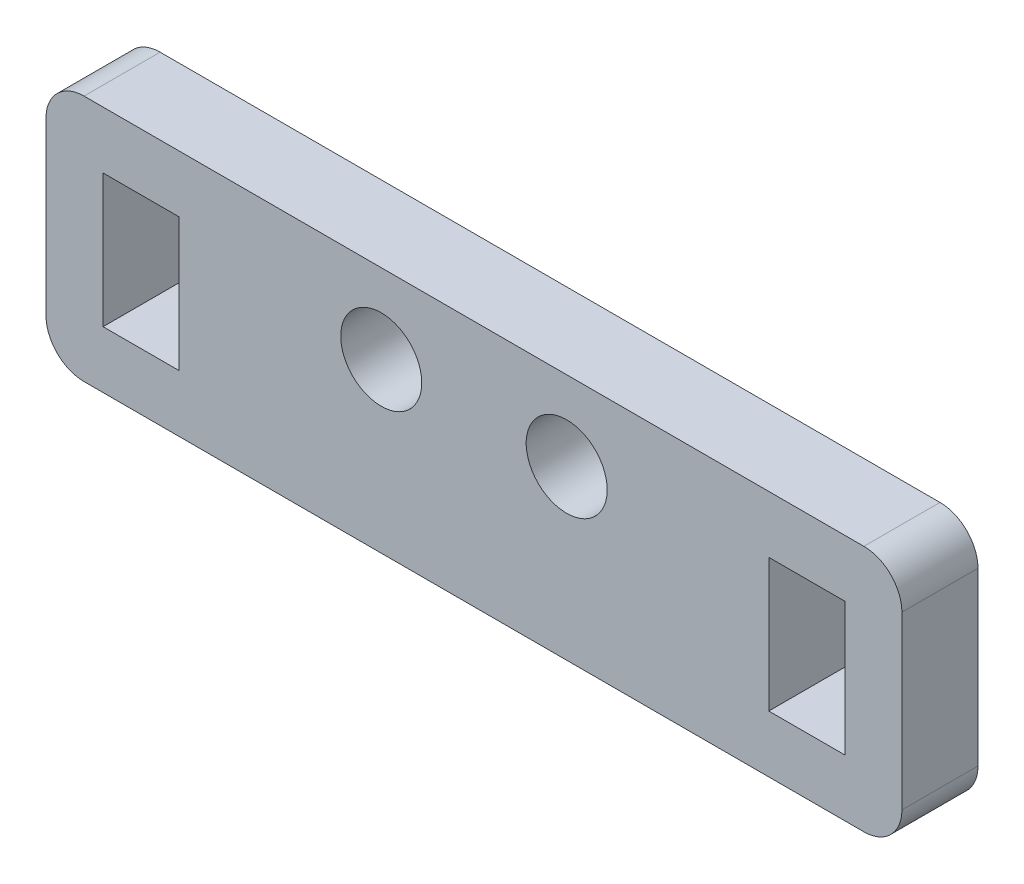
ISO-10303-21;
HEADER;
FILE_DESCRIPTION(('STEP AP214'),'2;1');
FILE_NAME('part.step','',(''),(''),'','','');
FILE_SCHEMA(('AUTOMOTIVE_DESIGN { 1 0 10303 214 1 1 1 1 }'));
ENDSEC;
DATA;
#1=APPLICATION_CONTEXT('core data for automotive mechanical design processes');
#2=APPLICATION_PROTOCOL_DEFINITION('international standard','automotive_design',2000,#1);
#3=PRODUCT_CONTEXT('',#1,'mechanical');
#4=PRODUCT('Part','Part','',(#3));
#5=PRODUCT_RELATED_PRODUCT_CATEGORY('part','',(#4));
#6=PRODUCT_DEFINITION_FORMATION('','',#4);
#7=PRODUCT_DEFINITION_CONTEXT('part definition',#1,'design');
#8=PRODUCT_DEFINITION('design','',#6,#7);
#9=PRODUCT_DEFINITION_SHAPE('','',#8);
#10=(LENGTH_UNIT() NAMED_UNIT(*) SI_UNIT(.MILLI.,.METRE.));
#11=(NAMED_UNIT(*) PLANE_ANGLE_UNIT() SI_UNIT($,.RADIAN.));
#12=(NAMED_UNIT(*) SI_UNIT($,.STERADIAN.) SOLID_ANGLE_UNIT());
#13=UNCERTAINTY_MEASURE_WITH_UNIT(LENGTH_MEASURE(1.E-05),#10,'distance_accuracy_value','');
#14=(GEOMETRIC_REPRESENTATION_CONTEXT(3) GLOBAL_UNCERTAINTY_ASSIGNED_CONTEXT((#13)) GLOBAL_UNIT_ASSIGNED_CONTEXT((#10,
#11,#12)) REPRESENTATION_CONTEXT('',''));
#15=CARTESIAN_POINT('',(0.,0.,0.));
#16=DIRECTION('',(0.,0.,1.));
#17=DIRECTION('',(1.,0.,0.));
#18=AXIS2_PLACEMENT_3D('',#15,#16,#17);
#19=CARTESIAN_POINT('',(0.,0.,4.));
#20=DIRECTION('',(0.,0.,-1.));
#21=DIRECTION('',(-1.,0.,0.));
#22=AXIS2_PLACEMENT_3D('',#19,#20,#21);
#23=PLANE('',#22);
#24=DIRECTION('',(0.,-1.,0.));
#25=VECTOR('',#24,1.);
#26=CARTESIAN_POINT('',(-19.5,3.5,4.));
#27=LINE('',#26,#25);
#28=CARTESIAN_POINT('',(-19.5,3.5,4.));
#29=VERTEX_POINT('',#28);
#30=CARTESIAN_POINT('',(-19.5,-3.5,4.));
#31=VERTEX_POINT('',#30);
#32=EDGE_CURVE('E198',#29,#31,#27,.T.);
#33=ORIENTED_EDGE('',*,*,#32,.F.);
#34=DIRECTION('',(-1.,0.,0.));
#35=VECTOR('',#34,1.);
#36=CARTESIAN_POINT('',(-19.5,3.5,4.));
#37=LINE('',#36,#35);
#38=CARTESIAN_POINT('',(-15.5,3.5,4.));
#39=VERTEX_POINT('',#38);
#40=EDGE_CURVE('E206',#39,#29,#37,.T.);
#41=ORIENTED_EDGE('',*,*,#40,.F.);
#42=DIRECTION('',(0.,1.,0.));
#43=VECTOR('',#42,1.);
#44=CARTESIAN_POINT('',(-15.5,3.5,4.));
#45=LINE('',#44,#43);
#46=CARTESIAN_POINT('',(-15.5,-3.5,4.));
#47=VERTEX_POINT('',#46);
#48=EDGE_CURVE('E203',#47,#39,#45,.T.);
#49=ORIENTED_EDGE('',*,*,#48,.F.);
#50=DIRECTION('',(1.,0.,0.));
#51=VECTOR('',#50,1.);
#52=CARTESIAN_POINT('',(-19.5,-3.5,4.));
#53=LINE('',#52,#51);
#54=EDGE_CURVE('E200',#31,#47,#53,.T.);
#55=ORIENTED_EDGE('',*,*,#54,.F.);
#56=EDGE_LOOP('',(#33,#41,#49,#55));
#57=FACE_BOUND('',#56,.T.);
#58=DIRECTION('',(1.,0.,0.));
#59=VECTOR('',#58,1.);
#60=CARTESIAN_POINT('',(-22.5,-6.5,4.));
#61=LINE('',#60,#59);
#62=CARTESIAN_POINT('',(-20.5,-6.5,4.));
#63=VERTEX_POINT('',#62);
#64=CARTESIAN_POINT('',(20.5,-6.5,4.));
#65=VERTEX_POINT('',#64);
#66=EDGE_CURVE('E232',#63,#65,#61,.T.);
#67=ORIENTED_EDGE('',*,*,#66,.T.);
#68=CARTESIAN_POINT('',(20.5,-4.5,4.));
#69=DIRECTION('',(0.,0.,-1.));
#70=DIRECTION('',(-1.,0.,0.));
#71=AXIS2_PLACEMENT_3D('',#68,#69,#70);
#72=CIRCLE('',#71,2.);
#73=CARTESIAN_POINT('',(22.5,-4.5,4.));
#74=VERTEX_POINT('',#73);
#75=EDGE_CURVE('E272',#65,#74,#72,.F.);
#76=ORIENTED_EDGE('',*,*,#75,.T.);
#77=DIRECTION('',(0.,1.,0.));
#78=VECTOR('',#77,1.);
#79=CARTESIAN_POINT('',(22.5,-6.5,4.));
#80=LINE('',#79,#78);
#81=CARTESIAN_POINT('',(22.5,4.5,4.));
#82=VERTEX_POINT('',#81);
#83=EDGE_CURVE('E236',#74,#82,#80,.T.);
#84=ORIENTED_EDGE('',*,*,#83,.T.);
#85=CARTESIAN_POINT('',(20.5,4.5,4.));
#86=DIRECTION('',(0.,0.,-1.));
#87=DIRECTION('',(-1.,0.,0.));
#88=AXIS2_PLACEMENT_3D('',#85,#86,#87);
#89=CIRCLE('',#88,2.);
#90=CARTESIAN_POINT('',(20.5,6.5,4.));
#91=VERTEX_POINT('',#90);
#92=EDGE_CURVE('E61',#82,#91,#89,.F.);
#93=ORIENTED_EDGE('',*,*,#92,.T.);
#94=DIRECTION('',(-1.,0.,0.));
#95=VECTOR('',#94,1.);
#96=CARTESIAN_POINT('',(-22.5,6.5,4.));
#97=LINE('',#96,#95);
#98=CARTESIAN_POINT('',(-20.5,6.5,4.));
#99=VERTEX_POINT('',#98);
#100=EDGE_CURVE('E238',#91,#99,#97,.T.);
#101=ORIENTED_EDGE('',*,*,#100,.T.);
#102=CARTESIAN_POINT('',(-20.5,4.5,4.));
#103=DIRECTION('',(0.,0.,-1.));
#104=DIRECTION('',(-1.,0.,0.));
#105=AXIS2_PLACEMENT_3D('',#102,#103,#104);
#106=CIRCLE('',#105,2.);
#107=CARTESIAN_POINT('',(-22.5,4.5,4.));
#108=VERTEX_POINT('',#107);
#109=EDGE_CURVE('E267',#99,#108,#106,.F.);
#110=ORIENTED_EDGE('',*,*,#109,.T.);
#111=DIRECTION('',(0.,-1.,0.));
#112=VECTOR('',#111,1.);
#113=CARTESIAN_POINT('',(-22.5,-6.5,4.));
#114=LINE('',#113,#112);
#115=CARTESIAN_POINT('',(-22.5,-4.5,4.));
#116=VERTEX_POINT('',#115);
#117=EDGE_CURVE('E229',#108,#116,#114,.T.);
#118=ORIENTED_EDGE('',*,*,#117,.T.);
#119=CARTESIAN_POINT('',(-20.5,-4.5,4.));
#120=DIRECTION('',(0.,0.,-1.));
#121=DIRECTION('',(-1.,0.,0.));
#122=AXIS2_PLACEMENT_3D('',#119,#120,#121);
#123=CIRCLE('',#122,2.);
#124=EDGE_CURVE('E269',#116,#63,#123,.F.);
#125=ORIENTED_EDGE('',*,*,#124,.T.);
#126=EDGE_LOOP('',(#67,#76,#84,#93,#101,#110,#118,#125));
#127=FACE_BOUND('',#126,.T.);
#128=DIRECTION('',(0.,-1.,0.));
#129=VECTOR('',#128,1.);
#130=CARTESIAN_POINT('',(15.5,3.5,4.));
#131=LINE('',#130,#129);
#132=CARTESIAN_POINT('',(15.5,3.5,4.));
#133=VERTEX_POINT('',#132);
#134=CARTESIAN_POINT('',(15.5,-3.5,4.));
#135=VERTEX_POINT('',#134);
#136=EDGE_CURVE('E154',#133,#135,#131,.T.);
#137=ORIENTED_EDGE('',*,*,#136,.F.);
#138=DIRECTION('',(-1.,0.,0.));
#139=VECTOR('',#138,1.);
#140=CARTESIAN_POINT('',(15.5,3.5,4.));
#141=LINE('',#140,#139);
#142=CARTESIAN_POINT('',(19.5,3.5,4.));
#143=VERTEX_POINT('',#142);
#144=EDGE_CURVE('E180',#143,#133,#141,.T.);
#145=ORIENTED_EDGE('',*,*,#144,.F.);
#146=DIRECTION('',(0.,1.,0.));
#147=VECTOR('',#146,1.);
#148=CARTESIAN_POINT('',(19.5,3.5,4.));
#149=LINE('',#148,#147);
#150=CARTESIAN_POINT('',(19.5,-3.5,4.));
#151=VERTEX_POINT('',#150);
#152=EDGE_CURVE('E178',#151,#143,#149,.T.);
#153=ORIENTED_EDGE('',*,*,#152,.F.);
#154=DIRECTION('',(1.,0.,0.));
#155=VECTOR('',#154,1.);
#156=CARTESIAN_POINT('',(15.5,-3.5,4.));
#157=LINE('',#156,#155);
#158=EDGE_CURVE('E164',#135,#151,#157,.T.);
#159=ORIENTED_EDGE('',*,*,#158,.F.);
#160=EDGE_LOOP('',(#137,#145,#153,#159));
#161=FACE_BOUND('',#160,.T.);
#162=CARTESIAN_POINT('',(4.875,2.32,4.));
#163=DIRECTION('',(0.,0.,1.));
#164=DIRECTION('',(1.,0.,0.));
#165=AXIS2_PLACEMENT_3D('',#162,#163,#164);
#166=CIRCLE('',#165,2.13);
#167=CARTESIAN_POINT('',(7.005,2.32,4.));
#168=VERTEX_POINT('',#167);
#169=EDGE_CURVE('E187',#168,#168,#166,.T.);
#170=ORIENTED_EDGE('',*,*,#169,.F.);
#171=EDGE_LOOP('',(#170));
#172=FACE_BOUND('',#171,.T.);
#173=CARTESIAN_POINT('',(-4.875,2.32,4.));
#174=DIRECTION('',(0.,0.,1.));
#175=DIRECTION('',(1.,0.,0.));
#176=AXIS2_PLACEMENT_3D('',#173,#174,#175);
#177=CIRCLE('',#176,2.13);
#178=CARTESIAN_POINT('',(-2.745,2.32,4.));
#179=VERTEX_POINT('',#178);
#180=EDGE_CURVE('E504',#179,#179,#177,.T.);
#181=ORIENTED_EDGE('',*,*,#180,.F.);
#182=EDGE_LOOP('',(#181));
#183=FACE_BOUND('',#182,.T.);
#184=ADVANCED_FACE('F39',(#57,#127,#161,#172,#183),#23,.F.);
#185=CARTESIAN_POINT('',(0.,0.,0.));
#186=DIRECTION('',(0.,0.,-1.));
#187=DIRECTION('',(-1.,0.,0.));
#188=AXIS2_PLACEMENT_3D('',#185,#186,#187);
#189=PLANE('',#188);
#190=CARTESIAN_POINT('',(4.875,2.32,0.));
#191=DIRECTION('',(0.,0.,1.));
#192=DIRECTION('',(1.,0.,0.));
#193=AXIS2_PLACEMENT_3D('',#190,#191,#192);
#194=CIRCLE('',#193,2.13);
#195=CARTESIAN_POINT('',(7.005,2.32,0.));
#196=VERTEX_POINT('',#195);
#197=EDGE_CURVE('E507',#196,#196,#194,.T.);
#198=ORIENTED_EDGE('',*,*,#197,.T.);
#199=EDGE_LOOP('',(#198));
#200=FACE_BOUND('',#199,.T.);
#201=DIRECTION('',(0.,1.,0.));
#202=VECTOR('',#201,1.);
#203=CARTESIAN_POINT('',(22.5,-6.5,0.));
#204=LINE('',#203,#202);
#205=CARTESIAN_POINT('',(22.5,-4.5,0.));
#206=VERTEX_POINT('',#205);
#207=CARTESIAN_POINT('',(22.5,4.5,0.));
#208=VERTEX_POINT('',#207);
#209=EDGE_CURVE('E246',#206,#208,#204,.T.);
#210=ORIENTED_EDGE('',*,*,#209,.F.);
#211=CARTESIAN_POINT('',(20.5,-4.5,0.));
#212=DIRECTION('',(0.,0.,-1.));
#213=DIRECTION('',(-1.,0.,0.));
#214=AXIS2_PLACEMENT_3D('',#211,#212,#213);
#215=CIRCLE('',#214,2.);
#216=CARTESIAN_POINT('',(20.5,-6.5,0.));
#217=VERTEX_POINT('',#216);
#218=EDGE_CURVE('E260',#206,#217,#215,.T.);
#219=ORIENTED_EDGE('',*,*,#218,.T.);
#220=DIRECTION('',(1.,0.,0.));
#221=VECTOR('',#220,1.);
#222=CARTESIAN_POINT('',(-22.5,-6.5,0.));
#223=LINE('',#222,#221);
#224=CARTESIAN_POINT('',(-20.5,-6.5,0.));
#225=VERTEX_POINT('',#224);
#226=EDGE_CURVE('E243',#225,#217,#223,.T.);
#227=ORIENTED_EDGE('',*,*,#226,.F.);
#228=CARTESIAN_POINT('',(-20.5,-4.5,0.));
#229=DIRECTION('',(0.,0.,-1.));
#230=DIRECTION('',(-1.,0.,0.));
#231=AXIS2_PLACEMENT_3D('',#228,#229,#230);
#232=CIRCLE('',#231,2.);
#233=CARTESIAN_POINT('',(-22.5,-4.5,0.));
#234=VERTEX_POINT('',#233);
#235=EDGE_CURVE('E256',#225,#234,#232,.T.);
#236=ORIENTED_EDGE('',*,*,#235,.T.);
#237=DIRECTION('',(0.,-1.,0.));
#238=VECTOR('',#237,1.);
#239=CARTESIAN_POINT('',(-22.5,-6.5,0.));
#240=LINE('',#239,#238);
#241=CARTESIAN_POINT('',(-22.5,4.5,0.));
#242=VERTEX_POINT('',#241);
#243=EDGE_CURVE('E228',#242,#234,#240,.T.);
#244=ORIENTED_EDGE('',*,*,#243,.F.);
#245=CARTESIAN_POINT('',(-20.5,4.5,0.));
#246=DIRECTION('',(0.,0.,-1.));
#247=DIRECTION('',(-1.,0.,0.));
#248=AXIS2_PLACEMENT_3D('',#245,#246,#247);
#249=CIRCLE('',#248,2.);
#250=CARTESIAN_POINT('',(-20.5,6.5,0.));
#251=VERTEX_POINT('',#250);
#252=EDGE_CURVE('E254',#242,#251,#249,.T.);
#253=ORIENTED_EDGE('',*,*,#252,.T.);
#254=DIRECTION('',(-1.,0.,0.));
#255=VECTOR('',#254,1.);
#256=CARTESIAN_POINT('',(-22.5,6.5,0.));
#257=LINE('',#256,#255);
#258=CARTESIAN_POINT('',(20.5,6.5,0.));
#259=VERTEX_POINT('',#258);
#260=EDGE_CURVE('E233',#259,#251,#257,.T.);
#261=ORIENTED_EDGE('',*,*,#260,.F.);
#262=CARTESIAN_POINT('',(20.5,4.5,0.));
#263=DIRECTION('',(0.,0.,-1.));
#264=DIRECTION('',(-1.,0.,0.));
#265=AXIS2_PLACEMENT_3D('',#262,#263,#264);
#266=CIRCLE('',#265,2.);
#267=EDGE_CURVE('E258',#259,#208,#266,.T.);
#268=ORIENTED_EDGE('',*,*,#267,.T.);
#269=EDGE_LOOP('',(#210,#219,#227,#236,#244,#253,#261,#268));
#270=FACE_BOUND('',#269,.T.);
#271=DIRECTION('',(-1.,0.,0.));
#272=VECTOR('',#271,1.);
#273=CARTESIAN_POINT('',(-19.5,3.5,0.));
#274=LINE('',#273,#272);
#275=CARTESIAN_POINT('',(-15.5,3.5,0.));
#276=VERTEX_POINT('',#275);
#277=CARTESIAN_POINT('',(-19.5,3.5,0.));
#278=VERTEX_POINT('',#277);
#279=EDGE_CURVE('E201',#276,#278,#274,.T.);
#280=ORIENTED_EDGE('',*,*,#279,.T.);
#281=DIRECTION('',(0.,-1.,0.));
#282=VECTOR('',#281,1.);
#283=CARTESIAN_POINT('',(-19.5,3.5,0.));
#284=LINE('',#283,#282);
#285=CARTESIAN_POINT('',(-19.5,-3.5,0.));
#286=VERTEX_POINT('',#285);
#287=EDGE_CURVE('E172',#278,#286,#284,.T.);
#288=ORIENTED_EDGE('',*,*,#287,.T.);
#289=DIRECTION('',(1.,0.,0.));
#290=VECTOR('',#289,1.);
#291=CARTESIAN_POINT('',(-19.5,-3.5,0.));
#292=LINE('',#291,#290);
#293=CARTESIAN_POINT('',(-15.5,-3.5,0.));
#294=VERTEX_POINT('',#293);
#295=EDGE_CURVE('E211',#286,#294,#292,.T.);
#296=ORIENTED_EDGE('',*,*,#295,.T.);
#297=DIRECTION('',(0.,1.,0.));
#298=VECTOR('',#297,1.);
#299=CARTESIAN_POINT('',(-15.5,3.5,0.));
#300=LINE('',#299,#298);
#301=EDGE_CURVE('E214',#294,#276,#300,.T.);
#302=ORIENTED_EDGE('',*,*,#301,.T.);
#303=EDGE_LOOP('',(#280,#288,#296,#302));
#304=FACE_BOUND('',#303,.T.);
#305=DIRECTION('',(-1.,0.,0.));
#306=VECTOR('',#305,1.);
#307=CARTESIAN_POINT('',(15.5,3.5,0.));
#308=LINE('',#307,#306);
#309=CARTESIAN_POINT('',(19.5,3.5,0.));
#310=VERTEX_POINT('',#309);
#311=CARTESIAN_POINT('',(15.5,3.5,0.));
#312=VERTEX_POINT('',#311);
#313=EDGE_CURVE('E165',#310,#312,#308,.T.);
#314=ORIENTED_EDGE('',*,*,#313,.T.);
#315=DIRECTION('',(0.,-1.,0.));
#316=VECTOR('',#315,1.);
#317=CARTESIAN_POINT('',(15.5,3.5,0.));
#318=LINE('',#317,#316);
#319=CARTESIAN_POINT('',(15.5,-3.5,0.));
#320=VERTEX_POINT('',#319);
#321=EDGE_CURVE('E185',#312,#320,#318,.T.);
#322=ORIENTED_EDGE('',*,*,#321,.T.);
#323=DIRECTION('',(1.,0.,0.));
#324=VECTOR('',#323,1.);
#325=CARTESIAN_POINT('',(15.5,-3.5,0.));
#326=LINE('',#325,#324);
#327=CARTESIAN_POINT('',(19.5,-3.5,0.));
#328=VERTEX_POINT('',#327);
#329=EDGE_CURVE('E171',#320,#328,#326,.T.);
#330=ORIENTED_EDGE('',*,*,#329,.T.);
#331=DIRECTION('',(0.,1.,0.));
#332=VECTOR('',#331,1.);
#333=CARTESIAN_POINT('',(19.5,3.5,0.));
#334=LINE('',#333,#332);
#335=EDGE_CURVE('E189',#328,#310,#334,.T.);
#336=ORIENTED_EDGE('',*,*,#335,.T.);
#337=EDGE_LOOP('',(#314,#322,#330,#336));
#338=FACE_BOUND('',#337,.T.);
#339=CARTESIAN_POINT('',(-4.875,2.32,0.));
#340=DIRECTION('',(0.,0.,1.));
#341=DIRECTION('',(1.,0.,0.));
#342=AXIS2_PLACEMENT_3D('',#339,#340,#341);
#343=CIRCLE('',#342,2.13);
#344=CARTESIAN_POINT('',(-2.745,2.32,0.));
#345=VERTEX_POINT('',#344);
#346=EDGE_CURVE('E502',#345,#345,#343,.T.);
#347=ORIENTED_EDGE('',*,*,#346,.T.);
#348=EDGE_LOOP('',(#347));
#349=FACE_BOUND('',#348,.T.);
#350=ADVANCED_FACE('F288',(#200,#270,#304,#338,#349),#189,.T.);
#351=CARTESIAN_POINT('',(-22.5,-6.5,4.));
#352=DIRECTION('',(1.,0.,0.));
#353=DIRECTION('',(0.,0.,-1.));
#354=AXIS2_PLACEMENT_3D('',#351,#352,#353);
#355=PLANE('',#354);
#356=ORIENTED_EDGE('',*,*,#243,.T.);
#357=DIRECTION('',(0.,0.,-1.));
#358=VECTOR('',#357,1.);
#359=CARTESIAN_POINT('',(-22.5,-4.5,4.));
#360=LINE('',#359,#358);
#361=EDGE_CURVE('E11',#234,#116,#360,.F.);
#362=ORIENTED_EDGE('',*,*,#361,.T.);
#363=ORIENTED_EDGE('',*,*,#117,.F.);
#364=DIRECTION('',(0.,0.,-1.));
#365=VECTOR('',#364,1.);
#366=CARTESIAN_POINT('',(-22.5,4.5,4.));
#367=LINE('',#366,#365);
#368=EDGE_CURVE('E47',#108,#242,#367,.T.);
#369=ORIENTED_EDGE('',*,*,#368,.T.);
#370=EDGE_LOOP('',(#356,#362,#363,#369));
#371=FACE_BOUND('',#370,.T.);
#372=ADVANCED_FACE('F282',(#371),#355,.F.);
#373=CARTESIAN_POINT('',(-22.5,-6.5,4.));
#374=DIRECTION('',(0.,1.,0.));
#375=DIRECTION('',(-1.,0.,0.));
#376=AXIS2_PLACEMENT_3D('',#373,#374,#375);
#377=PLANE('',#376);
#378=ORIENTED_EDGE('',*,*,#226,.T.);
#379=DIRECTION('',(0.,0.,-1.));
#380=VECTOR('',#379,1.);
#381=CARTESIAN_POINT('',(20.5,-6.5,4.));
#382=LINE('',#381,#380);
#383=EDGE_CURVE('E265',#217,#65,#382,.F.);
#384=ORIENTED_EDGE('',*,*,#383,.T.);
#385=ORIENTED_EDGE('',*,*,#66,.F.);
#386=DIRECTION('',(0.,0.,-1.));
#387=VECTOR('',#386,1.);
#388=CARTESIAN_POINT('',(-20.5,-6.5,4.));
#389=LINE('',#388,#387);
#390=EDGE_CURVE('E262',#63,#225,#389,.T.);
#391=ORIENTED_EDGE('',*,*,#390,.T.);
#392=EDGE_LOOP('',(#378,#384,#385,#391));
#393=FACE_BOUND('',#392,.T.);
#394=ADVANCED_FACE('F298',(#393),#377,.F.);
#395=CARTESIAN_POINT('',(22.5,-6.5,4.));
#396=DIRECTION('',(-1.,0.,0.));
#397=DIRECTION('',(0.,0.,1.));
#398=AXIS2_PLACEMENT_3D('',#395,#396,#397);
#399=PLANE('',#398);
#400=ORIENTED_EDGE('',*,*,#83,.F.);
#401=DIRECTION('',(0.,0.,-1.));
#402=VECTOR('',#401,1.);
#403=CARTESIAN_POINT('',(22.5,-4.5,4.));
#404=LINE('',#403,#402);
#405=EDGE_CURVE('E251',#74,#206,#404,.T.);
#406=ORIENTED_EDGE('',*,*,#405,.T.);
#407=ORIENTED_EDGE('',*,*,#209,.T.);
#408=DIRECTION('',(0.,0.,-1.));
#409=VECTOR('',#408,1.);
#410=CARTESIAN_POINT('',(22.5,4.5,4.));
#411=LINE('',#410,#409);
#412=EDGE_CURVE('E240',#208,#82,#411,.F.);
#413=ORIENTED_EDGE('',*,*,#412,.T.);
#414=EDGE_LOOP('',(#400,#406,#407,#413));
#415=FACE_BOUND('',#414,.T.);
#416=ADVANCED_FACE('F306',(#415),#399,.F.);
#417=CARTESIAN_POINT('',(-22.5,6.5,4.));
#418=DIRECTION('',(0.,-1.,0.));
#419=DIRECTION('',(1.,0.,0.));
#420=AXIS2_PLACEMENT_3D('',#417,#418,#419);
#421=PLANE('',#420);
#422=ORIENTED_EDGE('',*,*,#100,.F.);
#423=DIRECTION('',(0.,0.,-1.));
#424=VECTOR('',#423,1.);
#425=CARTESIAN_POINT('',(20.5,6.5,4.));
#426=LINE('',#425,#424);
#427=EDGE_CURVE('E275',#91,#259,#426,.T.);
#428=ORIENTED_EDGE('',*,*,#427,.T.);
#429=ORIENTED_EDGE('',*,*,#260,.T.);
#430=DIRECTION('',(0.,0.,-1.));
#431=VECTOR('',#430,1.);
#432=CARTESIAN_POINT('',(-20.5,6.5,4.));
#433=LINE('',#432,#431);
#434=EDGE_CURVE('E54',#251,#99,#433,.F.);
#435=ORIENTED_EDGE('',*,*,#434,.T.);
#436=EDGE_LOOP('',(#422,#428,#429,#435));
#437=FACE_BOUND('',#436,.T.);
#438=ADVANCED_FACE('F311',(#437),#421,.F.);
#439=CARTESIAN_POINT('',(-19.5,3.5,4.));
#440=DIRECTION('',(1.,0.,0.));
#441=DIRECTION('',(0.,0.,-1.));
#442=AXIS2_PLACEMENT_3D('',#439,#440,#441);
#443=PLANE('',#442);
#444=ORIENTED_EDGE('',*,*,#287,.F.);
#445=DIRECTION('',(0.,0.,-1.));
#446=VECTOR('',#445,1.);
#447=CARTESIAN_POINT('',(-19.5,3.5,4.));
#448=LINE('',#447,#446);
#449=EDGE_CURVE('E208',#29,#278,#448,.T.);
#450=ORIENTED_EDGE('',*,*,#449,.F.);
#451=ORIENTED_EDGE('',*,*,#32,.T.);
#452=DIRECTION('',(0.,0.,-1.));
#453=VECTOR('',#452,1.);
#454=CARTESIAN_POINT('',(-19.5,-3.5,4.));
#455=LINE('',#454,#453);
#456=EDGE_CURVE('E225',#31,#286,#455,.T.);
#457=ORIENTED_EDGE('',*,*,#456,.T.);
#458=EDGE_LOOP('',(#444,#450,#451,#457));
#459=FACE_BOUND('',#458,.T.);
#460=ADVANCED_FACE('F327',(#459),#443,.T.);
#461=CARTESIAN_POINT('',(-19.5,-3.5,4.));
#462=DIRECTION('',(0.,1.,0.));
#463=DIRECTION('',(0.,0.,1.));
#464=AXIS2_PLACEMENT_3D('',#461,#462,#463);
#465=PLANE('',#464);
#466=ORIENTED_EDGE('',*,*,#295,.F.);
#467=ORIENTED_EDGE('',*,*,#456,.F.);
#468=ORIENTED_EDGE('',*,*,#54,.T.);
#469=DIRECTION('',(0.,0.,-1.));
#470=VECTOR('',#469,1.);
#471=CARTESIAN_POINT('',(-15.5,-3.5,4.));
#472=LINE('',#471,#470);
#473=EDGE_CURVE('E223',#47,#294,#472,.T.);
#474=ORIENTED_EDGE('',*,*,#473,.T.);
#475=EDGE_LOOP('',(#466,#467,#468,#474));
#476=FACE_BOUND('',#475,.T.);
#477=ADVANCED_FACE('F427',(#476),#465,.T.);
#478=CARTESIAN_POINT('',(-15.5,3.5,4.));
#479=DIRECTION('',(-1.,0.,0.));
#480=DIRECTION('',(0.,0.,1.));
#481=AXIS2_PLACEMENT_3D('',#478,#479,#480);
#482=PLANE('',#481);
#483=ORIENTED_EDGE('',*,*,#301,.F.);
#484=ORIENTED_EDGE('',*,*,#473,.F.);
#485=ORIENTED_EDGE('',*,*,#48,.T.);
#486=DIRECTION('',(0.,0.,-1.));
#487=VECTOR('',#486,1.);
#488=CARTESIAN_POINT('',(-15.5,3.5,4.));
#489=LINE('',#488,#487);
#490=EDGE_CURVE('E221',#39,#276,#489,.T.);
#491=ORIENTED_EDGE('',*,*,#490,.T.);
#492=EDGE_LOOP('',(#483,#484,#485,#491));
#493=FACE_BOUND('',#492,.T.);
#494=ADVANCED_FACE('F418',(#493),#482,.T.);
#495=CARTESIAN_POINT('',(-19.5,3.5,4.));
#496=DIRECTION('',(0.,-1.,0.));
#497=DIRECTION('',(0.,0.,-1.));
#498=AXIS2_PLACEMENT_3D('',#495,#496,#497);
#499=PLANE('',#498);
#500=ORIENTED_EDGE('',*,*,#279,.F.);
#501=ORIENTED_EDGE('',*,*,#490,.F.);
#502=ORIENTED_EDGE('',*,*,#40,.T.);
#503=ORIENTED_EDGE('',*,*,#449,.T.);
#504=EDGE_LOOP('',(#500,#501,#502,#503));
#505=FACE_BOUND('',#504,.T.);
#506=ADVANCED_FACE('F410',(#505),#499,.T.);
#507=CARTESIAN_POINT('',(15.5,3.5,4.));
#508=DIRECTION('',(1.,0.,0.));
#509=DIRECTION('',(0.,0.,-1.));
#510=AXIS2_PLACEMENT_3D('',#507,#508,#509);
#511=PLANE('',#510);
#512=ORIENTED_EDGE('',*,*,#321,.F.);
#513=DIRECTION('',(0.,0.,-1.));
#514=VECTOR('',#513,1.);
#515=CARTESIAN_POINT('',(15.5,3.5,4.));
#516=LINE('',#515,#514);
#517=EDGE_CURVE('E160',#133,#312,#516,.T.);
#518=ORIENTED_EDGE('',*,*,#517,.F.);
#519=ORIENTED_EDGE('',*,*,#136,.T.);
#520=DIRECTION('',(0.,0.,-1.));
#521=VECTOR('',#520,1.);
#522=CARTESIAN_POINT('',(15.5,-3.5,4.));
#523=LINE('',#522,#521);
#524=EDGE_CURVE('E157',#135,#320,#523,.T.);
#525=ORIENTED_EDGE('',*,*,#524,.T.);
#526=EDGE_LOOP('',(#512,#518,#519,#525));
#527=FACE_BOUND('',#526,.T.);
#528=ADVANCED_FACE('F156',(#527),#511,.T.);
#529=CARTESIAN_POINT('',(15.5,-3.5,4.));
#530=DIRECTION('',(0.,1.,0.));
#531=DIRECTION('',(-1.,0.,0.));
#532=AXIS2_PLACEMENT_3D('',#529,#530,#531);
#533=PLANE('',#532);
#534=ORIENTED_EDGE('',*,*,#329,.F.);
#535=ORIENTED_EDGE('',*,*,#524,.F.);
#536=ORIENTED_EDGE('',*,*,#158,.T.);
#537=DIRECTION('',(0.,0.,-1.));
#538=VECTOR('',#537,1.);
#539=CARTESIAN_POINT('',(19.5,-3.5,4.));
#540=LINE('',#539,#538);
#541=EDGE_CURVE('E173',#151,#328,#540,.T.);
#542=ORIENTED_EDGE('',*,*,#541,.T.);
#543=EDGE_LOOP('',(#534,#535,#536,#542));
#544=FACE_BOUND('',#543,.T.);
#545=ADVANCED_FACE('F168',(#544),#533,.T.);
#546=CARTESIAN_POINT('',(19.5,3.5,4.));
#547=DIRECTION('',(-1.,0.,0.));
#548=DIRECTION('',(0.,0.,1.));
#549=AXIS2_PLACEMENT_3D('',#546,#547,#548);
#550=PLANE('',#549);
#551=ORIENTED_EDGE('',*,*,#335,.F.);
#552=ORIENTED_EDGE('',*,*,#541,.F.);
#553=ORIENTED_EDGE('',*,*,#152,.T.);
#554=DIRECTION('',(0.,0.,-1.));
#555=VECTOR('',#554,1.);
#556=CARTESIAN_POINT('',(19.5,3.5,4.));
#557=LINE('',#556,#555);
#558=EDGE_CURVE('E195',#143,#310,#557,.T.);
#559=ORIENTED_EDGE('',*,*,#558,.T.);
#560=EDGE_LOOP('',(#551,#552,#553,#559));
#561=FACE_BOUND('',#560,.T.);
#562=ADVANCED_FACE('F386',(#561),#550,.T.);
#563=CARTESIAN_POINT('',(15.5,3.5,4.));
#564=DIRECTION('',(0.,-1.,0.));
#565=DIRECTION('',(0.,0.,-1.));
#566=AXIS2_PLACEMENT_3D('',#563,#564,#565);
#567=PLANE('',#566);
#568=ORIENTED_EDGE('',*,*,#313,.F.);
#569=ORIENTED_EDGE('',*,*,#558,.F.);
#570=ORIENTED_EDGE('',*,*,#144,.T.);
#571=ORIENTED_EDGE('',*,*,#517,.T.);
#572=EDGE_LOOP('',(#568,#569,#570,#571));
#573=FACE_BOUND('',#572,.T.);
#574=ADVANCED_FACE('F377',(#573),#567,.T.);
#575=CARTESIAN_POINT('',(4.875,2.32,4.));
#576=DIRECTION('',(0.,0.,-1.));
#577=DIRECTION('',(-1.,0.,0.));
#578=AXIS2_PLACEMENT_3D('',#575,#576,#577);
#579=CYLINDRICAL_SURFACE('',#578,2.13);
#580=ORIENTED_EDGE('',*,*,#169,.T.);
#581=EDGE_LOOP('',(#580));
#582=FACE_BOUND('',#581,.T.);
#583=ORIENTED_EDGE('',*,*,#197,.F.);
#584=EDGE_LOOP('',(#583));
#585=FACE_BOUND('',#584,.T.);
#586=ADVANCED_FACE('F368',(#582,#585),#579,.F.);
#587=CARTESIAN_POINT('',(-4.875,2.32,4.));
#588=DIRECTION('',(0.,0.,-1.));
#589=DIRECTION('',(-1.,0.,0.));
#590=AXIS2_PLACEMENT_3D('',#587,#588,#589);
#591=CYLINDRICAL_SURFACE('',#590,2.13);
#592=ORIENTED_EDGE('',*,*,#180,.T.);
#593=EDGE_LOOP('',(#592));
#594=FACE_BOUND('',#593,.T.);
#595=ORIENTED_EDGE('',*,*,#346,.F.);
#596=EDGE_LOOP('',(#595));
#597=FACE_BOUND('',#596,.T.);
#598=ADVANCED_FACE('F340',(#594,#597),#591,.F.);
#599=CARTESIAN_POINT('',(20.5,-4.5,4.));
#600=DIRECTION('',(0.,0.,-1.));
#601=DIRECTION('',(-1.,0.,0.));
#602=AXIS2_PLACEMENT_3D('',#599,#600,#601);
#603=CYLINDRICAL_SURFACE('',#602,2.);
#604=ORIENTED_EDGE('',*,*,#75,.F.);
#605=ORIENTED_EDGE('',*,*,#383,.F.);
#606=ORIENTED_EDGE('',*,*,#218,.F.);
#607=ORIENTED_EDGE('',*,*,#405,.F.);
#608=EDGE_LOOP('',(#604,#605,#606,#607));
#609=FACE_BOUND('',#608,.T.);
#610=ADVANCED_FACE('F304',(#609),#603,.T.);
#611=CARTESIAN_POINT('',(20.5,4.5,4.));
#612=DIRECTION('',(0.,0.,-1.));
#613=DIRECTION('',(-1.,0.,0.));
#614=AXIS2_PLACEMENT_3D('',#611,#612,#613);
#615=CYLINDRICAL_SURFACE('',#614,2.);
#616=ORIENTED_EDGE('',*,*,#92,.F.);
#617=ORIENTED_EDGE('',*,*,#412,.F.);
#618=ORIENTED_EDGE('',*,*,#267,.F.);
#619=ORIENTED_EDGE('',*,*,#427,.F.);
#620=EDGE_LOOP('',(#616,#617,#618,#619));
#621=FACE_BOUND('',#620,.T.);
#622=ADVANCED_FACE('F310',(#621),#615,.T.);
#623=CARTESIAN_POINT('',(-20.5,-4.5,4.));
#624=DIRECTION('',(0.,0.,-1.));
#625=DIRECTION('',(-1.,0.,0.));
#626=AXIS2_PLACEMENT_3D('',#623,#624,#625);
#627=CYLINDRICAL_SURFACE('',#626,2.);
#628=ORIENTED_EDGE('',*,*,#124,.F.);
#629=ORIENTED_EDGE('',*,*,#361,.F.);
#630=ORIENTED_EDGE('',*,*,#235,.F.);
#631=ORIENTED_EDGE('',*,*,#390,.F.);
#632=EDGE_LOOP('',(#628,#629,#630,#631));
#633=FACE_BOUND('',#632,.T.);
#634=ADVANCED_FACE('F295',(#633),#627,.T.);
#635=CARTESIAN_POINT('',(-20.5,4.5,4.));
#636=DIRECTION('',(0.,0.,-1.));
#637=DIRECTION('',(-1.,0.,0.));
#638=AXIS2_PLACEMENT_3D('',#635,#636,#637);
#639=CYLINDRICAL_SURFACE('',#638,2.);
#640=ORIENTED_EDGE('',*,*,#109,.F.);
#641=ORIENTED_EDGE('',*,*,#434,.F.);
#642=ORIENTED_EDGE('',*,*,#252,.F.);
#643=ORIENTED_EDGE('',*,*,#368,.F.);
#644=EDGE_LOOP('',(#640,#641,#642,#643));
#645=FACE_BOUND('',#644,.T.);
#646=ADVANCED_FACE('F41',(#645),#639,.T.);
#647=CLOSED_SHELL('',(#184,#350,#372,#394,#416,#438,#460,#477,#494,#506,#528,#545,#562,#574,
#586,#598,#610,#622,#634,#646));
#648=MANIFOLD_SOLID_BREP('B2',#647);
#649=ADVANCED_BREP_SHAPE_REPRESENTATION('',(#18,#648),#14);
#650=SHAPE_DEFINITION_REPRESENTATION(#9,#649);
ENDSEC;
END-ISO-10303-21;
